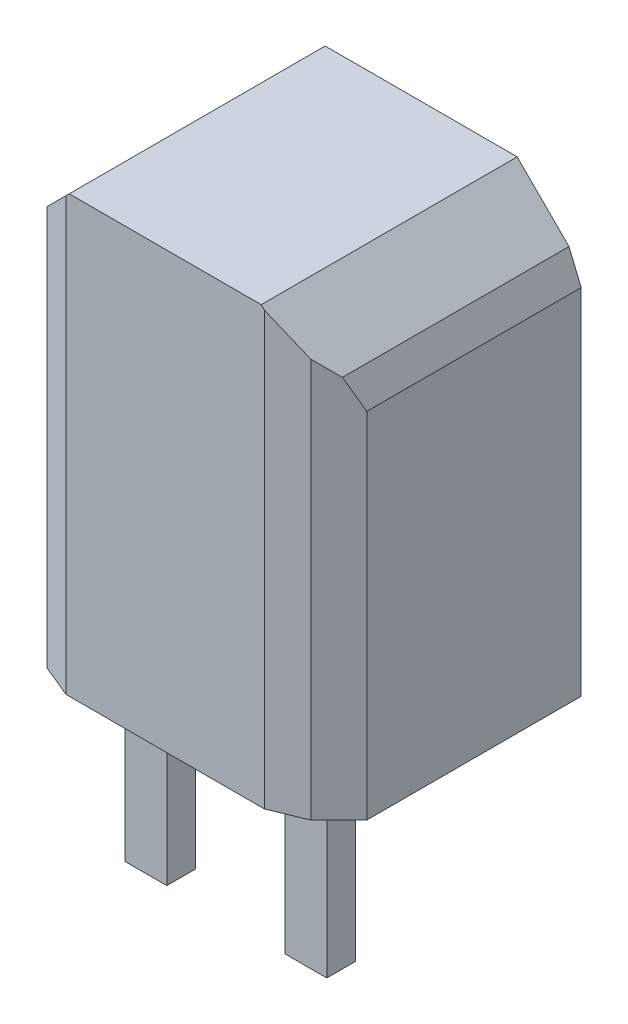
ISO-10303-21;
HEADER;
FILE_DESCRIPTION(('STEP AP214'),'2;1');
FILE_NAME('part.step','',(''),(''),'','','');
FILE_SCHEMA(('AUTOMOTIVE_DESIGN { 1 0 10303 214 1 1 1 1 }'));
ENDSEC;
DATA;
#1=APPLICATION_CONTEXT('core data for automotive mechanical design processes');
#2=APPLICATION_PROTOCOL_DEFINITION('international standard','automotive_design',2000,#1);
#3=PRODUCT_CONTEXT('',#1,'mechanical');
#4=PRODUCT('Part','Part','',(#3));
#5=PRODUCT_RELATED_PRODUCT_CATEGORY('part','',(#4));
#6=PRODUCT_DEFINITION_FORMATION('','',#4);
#7=PRODUCT_DEFINITION_CONTEXT('part definition',#1,'design');
#8=PRODUCT_DEFINITION('design','',#6,#7);
#9=PRODUCT_DEFINITION_SHAPE('','',#8);
#10=(LENGTH_UNIT() NAMED_UNIT(*) SI_UNIT(.MILLI.,.METRE.));
#11=(NAMED_UNIT(*) PLANE_ANGLE_UNIT() SI_UNIT($,.RADIAN.));
#12=(NAMED_UNIT(*) SI_UNIT($,.STERADIAN.) SOLID_ANGLE_UNIT());
#13=UNCERTAINTY_MEASURE_WITH_UNIT(LENGTH_MEASURE(1.E-05),#10,'distance_accuracy_value','');
#14=(GEOMETRIC_REPRESENTATION_CONTEXT(3) GLOBAL_UNCERTAINTY_ASSIGNED_CONTEXT((#13)) GLOBAL_UNIT_ASSIGNED_CONTEXT((#10,
#11,#12)) REPRESENTATION_CONTEXT('',''));
#15=CARTESIAN_POINT('',(0.,0.,0.));
#16=DIRECTION('',(0.,0.,1.));
#17=DIRECTION('',(1.,0.,0.));
#18=AXIS2_PLACEMENT_3D('',#15,#16,#17);
#19=CARTESIAN_POINT('',(0.,0.,4.));
#20=DIRECTION('',(0.,1.,0.));
#21=DIRECTION('',(0.,0.,1.));
#22=AXIS2_PLACEMENT_3D('',#19,#20,#21);
#23=PLANE('',#22);
#24=DIRECTION('',(0.,0.,1.));
#25=VECTOR('',#24,1.);
#26=CARTESIAN_POINT('',(1.575,0.,3.05));
#27=LINE('',#26,#25);
#28=CARTESIAN_POINT('',(1.575,0.,2.6));
#29=VERTEX_POINT('',#28);
#30=CARTESIAN_POINT('',(1.575,0.,3.05));
#31=VERTEX_POINT('',#30);
#32=EDGE_CURVE('E209',#29,#31,#27,.T.);
#33=ORIENTED_EDGE('',*,*,#32,.F.);
#34=DIRECTION('',(1.,0.,0.));
#35=VECTOR('',#34,1.);
#36=CARTESIAN_POINT('',(0.925,0.,2.6));
#37=LINE('',#36,#35);
#38=CARTESIAN_POINT('',(0.925,0.,2.6));
#39=VERTEX_POINT('',#38);
#40=EDGE_CURVE('E225',#39,#29,#37,.T.);
#41=ORIENTED_EDGE('',*,*,#40,.F.);
#42=DIRECTION('',(0.,0.,-1.));
#43=VECTOR('',#42,1.);
#44=CARTESIAN_POINT('',(0.925,0.,3.05));
#45=LINE('',#44,#43);
#46=CARTESIAN_POINT('',(0.925,0.,3.05));
#47=VERTEX_POINT('',#46);
#48=EDGE_CURVE('E238',#47,#39,#45,.T.);
#49=ORIENTED_EDGE('',*,*,#48,.F.);
#50=DIRECTION('',(-1.,0.,0.));
#51=VECTOR('',#50,1.);
#52=CARTESIAN_POINT('',(0.925,0.,3.05));
#53=LINE('',#52,#51);
#54=EDGE_CURVE('E214',#31,#47,#53,.T.);
#55=ORIENTED_EDGE('',*,*,#54,.F.);
#56=EDGE_LOOP('',(#33,#41,#49,#55));
#57=FACE_BOUND('',#56,.T.);
#58=DIRECTION('',(0.707106781186546,0.,-0.707106781186549));
#59=VECTOR('',#58,1.);
#60=CARTESIAN_POINT('',(4.35,0.,4.));
#61=LINE('',#60,#59);
#62=CARTESIAN_POINT('',(5.,0.,3.35));
#63=VERTEX_POINT('',#62);
#64=CARTESIAN_POINT('',(4.56213203435597,0.,3.78786796564403));
#65=VERTEX_POINT('',#64);
#66=EDGE_CURVE('E319',#63,#65,#61,.F.);
#67=ORIENTED_EDGE('',*,*,#66,.T.);
#68=DIRECTION('',(0.923879532511287,0.,-0.382683432365091));
#69=VECTOR('',#68,1.);
#70=CARTESIAN_POINT('',(4.05,0.,4.));
#71=LINE('',#70,#69);
#72=CARTESIAN_POINT('',(4.05,0.,4.));
#73=VERTEX_POINT('',#72);
#74=EDGE_CURVE('E13',#65,#73,#71,.F.);
#75=ORIENTED_EDGE('',*,*,#74,.T.);
#76=DIRECTION('',(1.,0.,0.));
#77=VECTOR('',#76,1.);
#78=CARTESIAN_POINT('',(0.,0.,4.));
#79=LINE('',#78,#77);
#80=CARTESIAN_POINT('',(0.950000000000004,0.,4.));
#81=VERTEX_POINT('',#80);
#82=EDGE_CURVE('E261',#81,#73,#79,.T.);
#83=ORIENTED_EDGE('',*,*,#82,.F.);
#84=DIRECTION('',(0.923879532511287,0.,0.38268343236509));
#85=VECTOR('',#84,1.);
#86=CARTESIAN_POINT('',(0.950000000000004,0.,4.));
#87=LINE('',#86,#85);
#88=CARTESIAN_POINT('',(0.437867965644034,0.,3.78786796564403));
#89=VERTEX_POINT('',#88);
#90=EDGE_CURVE('E362',#81,#89,#87,.F.);
#91=ORIENTED_EDGE('',*,*,#90,.T.);
#92=DIRECTION('',(0.707106781186546,0.,0.707106781186549));
#93=VECTOR('',#92,1.);
#94=CARTESIAN_POINT('',(0.65,0.,4.));
#95=LINE('',#94,#93);
#96=CARTESIAN_POINT('',(0.,0.,3.35));
#97=VERTEX_POINT('',#96);
#98=EDGE_CURVE('E316',#89,#97,#95,.F.);
#99=ORIENTED_EDGE('',*,*,#98,.T.);
#100=DIRECTION('',(0.,0.,-1.));
#101=VECTOR('',#100,1.);
#102=CARTESIAN_POINT('',(0.,0.,4.));
#103=LINE('',#102,#101);
#104=CARTESIAN_POINT('',(0.,0.,0.));
#105=VERTEX_POINT('',#104);
#106=EDGE_CURVE('E306',#97,#105,#103,.T.);
#107=ORIENTED_EDGE('',*,*,#106,.T.);
#108=DIRECTION('',(1.,0.,0.));
#109=VECTOR('',#108,1.);
#110=CARTESIAN_POINT('',(0.,0.,0.));
#111=LINE('',#110,#109);
#112=CARTESIAN_POINT('',(5.,0.,0.));
#113=VERTEX_POINT('',#112);
#114=EDGE_CURVE('E279',#105,#113,#111,.T.);
#115=ORIENTED_EDGE('',*,*,#114,.T.);
#116=DIRECTION('',(0.,0.,-1.));
#117=VECTOR('',#116,1.);
#118=CARTESIAN_POINT('',(5.,0.,4.));
#119=LINE('',#118,#117);
#120=EDGE_CURVE('E303',#63,#113,#119,.T.);
#121=ORIENTED_EDGE('',*,*,#120,.F.);
#122=EDGE_LOOP('',(#67,#75,#83,#91,#99,#107,#115,#121));
#123=FACE_BOUND('',#122,.T.);
#124=DIRECTION('',(-1.,0.,0.));
#125=VECTOR('',#124,1.);
#126=CARTESIAN_POINT('',(4.075,0.,3.05));
#127=LINE('',#126,#125);
#128=CARTESIAN_POINT('',(4.075,0.,3.05));
#129=VERTEX_POINT('',#128);
#130=CARTESIAN_POINT('',(3.425,0.,3.05));
#131=VERTEX_POINT('',#130);
#132=EDGE_CURVE('E207',#129,#131,#127,.T.);
#133=ORIENTED_EDGE('',*,*,#132,.F.);
#134=DIRECTION('',(0.,0.,1.));
#135=VECTOR('',#134,1.);
#136=CARTESIAN_POINT('',(4.075,0.,3.05));
#137=LINE('',#136,#135);
#138=CARTESIAN_POINT('',(4.075,0.,2.6));
#139=VERTEX_POINT('',#138);
#140=EDGE_CURVE('E204',#139,#129,#137,.T.);
#141=ORIENTED_EDGE('',*,*,#140,.F.);
#142=DIRECTION('',(1.,0.,0.));
#143=VECTOR('',#142,1.);
#144=CARTESIAN_POINT('',(4.075,0.,2.6));
#145=LINE('',#144,#143);
#146=CARTESIAN_POINT('',(3.425,0.,2.6));
#147=VERTEX_POINT('',#146);
#148=EDGE_CURVE('E69',#147,#139,#145,.T.);
#149=ORIENTED_EDGE('',*,*,#148,.F.);
#150=DIRECTION('',(0.,0.,-1.));
#151=VECTOR('',#150,1.);
#152=CARTESIAN_POINT('',(3.425,0.,3.05));
#153=LINE('',#152,#151);
#154=EDGE_CURVE('E64',#131,#147,#153,.T.);
#155=ORIENTED_EDGE('',*,*,#154,.F.);
#156=EDGE_LOOP('',(#133,#141,#149,#155));
#157=FACE_BOUND('',#156,.T.);
#158=ADVANCED_FACE('F47',(#57,#123,#157),#23,.F.);
#159=CARTESIAN_POINT('',(0.,0.,4.));
#160=DIRECTION('',(1.,0.,0.));
#161=DIRECTION('',(0.,0.,-1.));
#162=AXIS2_PLACEMENT_3D('',#159,#160,#161);
#163=PLANE('',#162);
#164=DIRECTION('',(0.,1.,0.));
#165=VECTOR('',#164,1.);
#166=CARTESIAN_POINT('',(0.,0.,3.35));
#167=LINE('',#166,#165);
#168=CARTESIAN_POINT('',(0.,5.53076118445749,3.35));
#169=VERTEX_POINT('',#168);
#170=EDGE_CURVE('E323',#97,#169,#167,.T.);
#171=ORIENTED_EDGE('',*,*,#170,.T.);
#172=DIRECTION('',(0.,0.,-1.));
#173=VECTOR('',#172,1.);
#174=CARTESIAN_POINT('',(0.,5.53076118445749,4.));
#175=LINE('',#174,#173);
#176=CARTESIAN_POINT('',(0.,5.53076118445749,0.));
#177=VERTEX_POINT('',#176);
#178=EDGE_CURVE('E331',#169,#177,#175,.T.);
#179=ORIENTED_EDGE('',*,*,#178,.T.);
#180=DIRECTION('',(0.,-1.,0.));
#181=VECTOR('',#180,1.);
#182=CARTESIAN_POINT('',(0.,0.,0.));
#183=LINE('',#182,#181);
#184=EDGE_CURVE('E260',#177,#105,#183,.T.);
#185=ORIENTED_EDGE('',*,*,#184,.T.);
#186=ORIENTED_EDGE('',*,*,#106,.F.);
#187=EDGE_LOOP('',(#171,#179,#185,#186));
#188=FACE_BOUND('',#187,.T.);
#189=ADVANCED_FACE('F418',(#188),#163,.F.);
#190=CARTESIAN_POINT('',(5.,5.8,4.));
#191=DIRECTION('',(-1.,0.,0.));
#192=DIRECTION('',(0.,0.,1.));
#193=AXIS2_PLACEMENT_3D('',#190,#191,#192);
#194=PLANE('',#193);
#195=DIRECTION('',(0.,1.,0.));
#196=VECTOR('',#195,1.);
#197=CARTESIAN_POINT('',(5.,5.8,0.));
#198=LINE('',#197,#196);
#199=CARTESIAN_POINT('',(5.,5.53076118445749,0.));
#200=VERTEX_POINT('',#199);
#201=EDGE_CURVE('E283',#113,#200,#198,.T.);
#202=ORIENTED_EDGE('',*,*,#201,.T.);
#203=DIRECTION('',(0.,0.,1.));
#204=VECTOR('',#203,1.);
#205=CARTESIAN_POINT('',(5.,5.53076118445749,4.));
#206=LINE('',#205,#204);
#207=CARTESIAN_POINT('',(5.,5.53076118445749,3.35));
#208=VERTEX_POINT('',#207);
#209=EDGE_CURVE('E351',#200,#208,#206,.T.);
#210=ORIENTED_EDGE('',*,*,#209,.T.);
#211=DIRECTION('',(0.,-1.,0.));
#212=VECTOR('',#211,1.);
#213=CARTESIAN_POINT('',(5.,5.8,3.35));
#214=LINE('',#213,#212);
#215=EDGE_CURVE('E313',#208,#63,#214,.T.);
#216=ORIENTED_EDGE('',*,*,#215,.T.);
#217=ORIENTED_EDGE('',*,*,#120,.T.);
#218=EDGE_LOOP('',(#202,#210,#216,#217));
#219=FACE_BOUND('',#218,.T.);
#220=ADVANCED_FACE('F443',(#219),#194,.F.);
#221=CARTESIAN_POINT('',(4.,6.8,4.));
#222=DIRECTION('',(-0.707106781186547,-0.707106781186547,0.));
#223=DIRECTION('',(0.707106781186548,-0.707106781186548,0.));
#224=AXIS2_PLACEMENT_3D('',#221,#222,#223);
#225=PLANE('',#224);
#226=DIRECTION('',(-0.707106781186548,0.707106781186548,0.));
#227=VECTOR('',#226,1.);
#228=CARTESIAN_POINT('',(4.,6.8,4.));
#229=LINE('',#228,#227);
#230=CARTESIAN_POINT('',(4.05,6.75,4.));
#231=VERTEX_POINT('',#230);
#232=CARTESIAN_POINT('',(4.,6.8,4.));
#233=VERTEX_POINT('',#232);
#234=EDGE_CURVE('E265',#231,#233,#229,.T.);
#235=ORIENTED_EDGE('',*,*,#234,.F.);
#236=DIRECTION('',(-0.678598344545847,0.678598344545847,0.281084637714821));
#237=VECTOR('',#236,1.);
#238=CARTESIAN_POINT('',(7.15834606423746,3.64165393576254,2.71248090364381));
#239=LINE('',#238,#237);
#240=CARTESIAN_POINT('',(4.56213203435597,6.23786796564403,3.78786796564403));
#241=VERTEX_POINT('',#240);
#242=EDGE_CURVE('E375',#231,#241,#239,.F.);
#243=ORIENTED_EDGE('',*,*,#242,.T.);
#244=DIRECTION('',(-0.577350269189625,0.577350269189625,0.577350269189627));
#245=VECTOR('',#244,1.);
#246=CARTESIAN_POINT('',(6.5,4.3,1.85));
#247=LINE('',#246,#245);
#248=CARTESIAN_POINT('',(4.80961940777126,5.99038059222874,3.54038059222875));
#249=VERTEX_POINT('',#248);
#250=EDGE_CURVE('E310',#241,#249,#247,.F.);
#251=ORIENTED_EDGE('',*,*,#250,.T.);
#252=DIRECTION('',(0.,0.,-1.));
#253=VECTOR('',#252,1.);
#254=CARTESIAN_POINT('',(4.80961940777126,5.99038059222874,4.));
#255=LINE('',#254,#253);
#256=CARTESIAN_POINT('',(4.80961940777126,5.99038059222874,0.));
#257=VERTEX_POINT('',#256);
#258=EDGE_CURVE('E344',#249,#257,#255,.T.);
#259=ORIENTED_EDGE('',*,*,#258,.T.);
#260=DIRECTION('',(-0.707106781186548,0.707106781186548,0.));
#261=VECTOR('',#260,1.);
#262=CARTESIAN_POINT('',(4.,6.8,0.));
#263=LINE('',#262,#261);
#264=CARTESIAN_POINT('',(4.,6.8,0.));
#265=VERTEX_POINT('',#264);
#266=EDGE_CURVE('E287',#257,#265,#263,.T.);
#267=ORIENTED_EDGE('',*,*,#266,.T.);
#268=DIRECTION('',(0.,0.,-1.));
#269=VECTOR('',#268,1.);
#270=CARTESIAN_POINT('',(4.,6.8,4.));
#271=LINE('',#270,#269);
#272=EDGE_CURVE('E299',#233,#265,#271,.T.);
#273=ORIENTED_EDGE('',*,*,#272,.F.);
#274=EDGE_LOOP('',(#235,#243,#251,#259,#267,#273));
#275=FACE_BOUND('',#274,.T.);
#276=ADVANCED_FACE('F395',(#275),#225,.F.);
#277=CARTESIAN_POINT('',(1.,6.8,4.));
#278=DIRECTION('',(0.,-1.,0.));
#279=DIRECTION('',(0.,0.,-1.));
#280=AXIS2_PLACEMENT_3D('',#277,#278,#279);
#281=PLANE('',#280);
#282=DIRECTION('',(-1.,0.,0.));
#283=VECTOR('',#282,1.);
#284=CARTESIAN_POINT('',(1.,6.8,0.));
#285=LINE('',#284,#283);
#286=CARTESIAN_POINT('',(1.,6.8,0.));
#287=VERTEX_POINT('',#286);
#288=EDGE_CURVE('E290',#265,#287,#285,.T.);
#289=ORIENTED_EDGE('',*,*,#288,.T.);
#290=DIRECTION('',(0.,0.,-1.));
#291=VECTOR('',#290,1.);
#292=CARTESIAN_POINT('',(1.,6.8,4.));
#293=LINE('',#292,#291);
#294=CARTESIAN_POINT('',(1.,6.8,4.));
#295=VERTEX_POINT('',#294);
#296=EDGE_CURVE('E276',#295,#287,#293,.T.);
#297=ORIENTED_EDGE('',*,*,#296,.F.);
#298=DIRECTION('',(-1.,0.,0.));
#299=VECTOR('',#298,1.);
#300=CARTESIAN_POINT('',(1.,6.8,4.));
#301=LINE('',#300,#299);
#302=EDGE_CURVE('E269',#233,#295,#301,.T.);
#303=ORIENTED_EDGE('',*,*,#302,.F.);
#304=ORIENTED_EDGE('',*,*,#272,.T.);
#305=EDGE_LOOP('',(#289,#297,#303,#304));
#306=FACE_BOUND('',#305,.T.);
#307=ADVANCED_FACE('F401',(#306),#281,.F.);
#308=CARTESIAN_POINT('',(0.,5.8,4.));
#309=DIRECTION('',(0.707106781186547,-0.707106781186547,0.));
#310=DIRECTION('',(0.707106781186548,0.707106781186548,0.));
#311=AXIS2_PLACEMENT_3D('',#308,#309,#310);
#312=PLANE('',#311);
#313=DIRECTION('',(-0.577350269189625,-0.577350269189625,-0.577350269189627));
#314=VECTOR('',#313,1.);
#315=CARTESIAN_POINT('',(-1.49999999999999,4.3,1.85));
#316=LINE('',#315,#314);
#317=CARTESIAN_POINT('',(0.190380592228745,5.99038059222874,3.54038059222874));
#318=VERTEX_POINT('',#317);
#319=CARTESIAN_POINT('',(0.437867965644034,6.23786796564403,3.78786796564403));
#320=VERTEX_POINT('',#319);
#321=EDGE_CURVE('E327',#318,#320,#316,.F.);
#322=ORIENTED_EDGE('',*,*,#321,.T.);
#323=DIRECTION('',(-0.678598344545847,-0.678598344545847,-0.281084637714821));
#324=VECTOR('',#323,1.);
#325=CARTESIAN_POINT('',(-2.15834606423745,3.64165393576254,2.71248090364381));
#326=LINE('',#325,#324);
#327=CARTESIAN_POINT('',(0.950000000000004,6.75,4.));
#328=VERTEX_POINT('',#327);
#329=EDGE_CURVE('E368',#320,#328,#326,.F.);
#330=ORIENTED_EDGE('',*,*,#329,.T.);
#331=DIRECTION('',(-0.707106781186548,-0.707106781186548,0.));
#332=VECTOR('',#331,1.);
#333=CARTESIAN_POINT('',(0.,5.8,4.));
#334=LINE('',#333,#332);
#335=EDGE_CURVE('E272',#295,#328,#334,.T.);
#336=ORIENTED_EDGE('',*,*,#335,.F.);
#337=ORIENTED_EDGE('',*,*,#296,.T.);
#338=DIRECTION('',(-0.707106781186548,-0.707106781186548,0.));
#339=VECTOR('',#338,1.);
#340=CARTESIAN_POINT('',(0.,5.8,0.));
#341=LINE('',#340,#339);
#342=CARTESIAN_POINT('',(0.190380592228745,5.99038059222874,0.));
#343=VERTEX_POINT('',#342);
#344=EDGE_CURVE('E266',#287,#343,#341,.T.);
#345=ORIENTED_EDGE('',*,*,#344,.T.);
#346=DIRECTION('',(0.,0.,1.));
#347=VECTOR('',#346,1.);
#348=CARTESIAN_POINT('',(0.190380592228745,5.99038059222874,4.));
#349=LINE('',#348,#347);
#350=EDGE_CURVE('E338',#343,#318,#349,.T.);
#351=ORIENTED_EDGE('',*,*,#350,.T.);
#352=EDGE_LOOP('',(#322,#330,#336,#337,#345,#351));
#353=FACE_BOUND('',#352,.T.);
#354=ADVANCED_FACE('F427',(#353),#312,.F.);
#355=CARTESIAN_POINT('',(0.,0.,4.));
#356=DIRECTION('',(0.,0.,-1.));
#357=DIRECTION('',(-1.,0.,0.));
#358=AXIS2_PLACEMENT_3D('',#355,#356,#357);
#359=PLANE('',#358);
#360=ORIENTED_EDGE('',*,*,#82,.T.);
#361=DIRECTION('',(0.,1.,0.));
#362=VECTOR('',#361,1.);
#363=CARTESIAN_POINT('',(4.05,6.45,4.));
#364=LINE('',#363,#362);
#365=EDGE_CURVE('E371',#73,#231,#364,.T.);
#366=ORIENTED_EDGE('',*,*,#365,.T.);
#367=ORIENTED_EDGE('',*,*,#234,.T.);
#368=ORIENTED_EDGE('',*,*,#302,.T.);
#369=ORIENTED_EDGE('',*,*,#335,.T.);
#370=DIRECTION('',(0.,-1.,0.));
#371=VECTOR('',#370,1.);
#372=CARTESIAN_POINT('',(0.950000000000004,0.,4.));
#373=LINE('',#372,#371);
#374=EDGE_CURVE('E358',#328,#81,#373,.T.);
#375=ORIENTED_EDGE('',*,*,#374,.T.);
#376=EDGE_LOOP('',(#360,#366,#367,#368,#369,#375));
#377=FACE_BOUND('',#376,.T.);
#378=ADVANCED_FACE('F392',(#377),#359,.F.);
#379=CARTESIAN_POINT('',(0.,0.,0.));
#380=DIRECTION('',(0.,0.,-1.));
#381=DIRECTION('',(-1.,0.,0.));
#382=AXIS2_PLACEMENT_3D('',#379,#380,#381);
#383=PLANE('',#382);
#384=ORIENTED_EDGE('',*,*,#266,.F.);
#385=DIRECTION('',(-0.38268343236509,0.923879532511287,0.));
#386=VECTOR('',#385,1.);
#387=CARTESIAN_POINT('',(6.22318632229299,2.5777281758685,0.));
#388=LINE('',#387,#386);
#389=EDGE_CURVE('E348',#257,#200,#388,.F.);
#390=ORIENTED_EDGE('',*,*,#389,.T.);
#391=ORIENTED_EDGE('',*,*,#201,.F.);
#392=ORIENTED_EDGE('',*,*,#114,.F.);
#393=ORIENTED_EDGE('',*,*,#184,.F.);
#394=DIRECTION('',(-0.382683432365091,-0.923879532511286,0.));
#395=VECTOR('',#394,1.);
#396=CARTESIAN_POINT('',(-1.95541936932662,0.809961222902132,0.));
#397=LINE('',#396,#395);
#398=EDGE_CURVE('E335',#177,#343,#397,.F.);
#399=ORIENTED_EDGE('',*,*,#398,.T.);
#400=ORIENTED_EDGE('',*,*,#344,.F.);
#401=ORIENTED_EDGE('',*,*,#288,.F.);
#402=EDGE_LOOP('',(#384,#390,#391,#392,#393,#399,#400,#401));
#403=FACE_BOUND('',#402,.T.);
#404=ADVANCED_FACE('F425',(#403),#383,.T.);
#405=CARTESIAN_POINT('',(4.35,0.,4.));
#406=DIRECTION('',(-0.707106781186549,0.,-0.707106781186546));
#407=DIRECTION('',(0.,1.,0.));
#408=AXIS2_PLACEMENT_3D('',#405,#406,#407);
#409=PLANE('',#408);
#410=ORIENTED_EDGE('',*,*,#250,.F.);
#411=DIRECTION('',(0.,1.,0.));
#412=VECTOR('',#411,1.);
#413=CARTESIAN_POINT('',(4.56213203435597,0.,3.78786796564403));
#414=LINE('',#413,#412);
#415=EDGE_CURVE('E57',#241,#65,#414,.F.);
#416=ORIENTED_EDGE('',*,*,#415,.T.);
#417=ORIENTED_EDGE('',*,*,#66,.F.);
#418=ORIENTED_EDGE('',*,*,#215,.F.);
#419=DIRECTION('',(-0.357406744336594,0.862856209461016,0.357406744336595));
#420=VECTOR('',#419,1.);
#421=CARTESIAN_POINT('',(6.53957346344394,1.81390204874142,1.81042653655606));
#422=LINE('',#421,#420);
#423=EDGE_CURVE('E354',#208,#249,#422,.T.);
#424=ORIENTED_EDGE('',*,*,#423,.T.);
#425=EDGE_LOOP('',(#410,#416,#417,#418,#424));
#426=FACE_BOUND('',#425,.T.);
#427=ADVANCED_FACE('F382',(#426),#409,.F.);
#428=CARTESIAN_POINT('',(0.65,0.,4.));
#429=DIRECTION('',(0.707106781186549,0.,-0.707106781186546));
#430=DIRECTION('',(0.,-1.,0.));
#431=AXIS2_PLACEMENT_3D('',#428,#429,#430);
#432=PLANE('',#431);
#433=ORIENTED_EDGE('',*,*,#98,.F.);
#434=DIRECTION('',(0.,-1.,0.));
#435=VECTOR('',#434,1.);
#436=CARTESIAN_POINT('',(0.437867965644034,6.45,3.78786796564403));
#437=LINE('',#436,#435);
#438=EDGE_CURVE('E365',#89,#320,#437,.F.);
#439=ORIENTED_EDGE('',*,*,#438,.T.);
#440=ORIENTED_EDGE('',*,*,#321,.F.);
#441=DIRECTION('',(-0.357406744336594,-0.862856209461016,-0.357406744336595));
#442=VECTOR('',#441,1.);
#443=CARTESIAN_POINT('',(-1.53957346344394,1.81390204874143,1.81042653655606));
#444=LINE('',#443,#442);
#445=EDGE_CURVE('E341',#318,#169,#444,.T.);
#446=ORIENTED_EDGE('',*,*,#445,.T.);
#447=ORIENTED_EDGE('',*,*,#170,.F.);
#448=EDGE_LOOP('',(#433,#439,#440,#446,#447));
#449=FACE_BOUND('',#448,.T.);
#450=ADVANCED_FACE('F413',(#449),#432,.F.);
#451=CARTESIAN_POINT('',(0.,5.53076118445749,4.));
#452=DIRECTION('',(0.923879532511286,-0.382683432365091,0.));
#453=DIRECTION('',(0.,0.,-1.));
#454=AXIS2_PLACEMENT_3D('',#451,#452,#453);
#455=PLANE('',#454);
#456=ORIENTED_EDGE('',*,*,#445,.F.);
#457=ORIENTED_EDGE('',*,*,#350,.F.);
#458=ORIENTED_EDGE('',*,*,#398,.F.);
#459=ORIENTED_EDGE('',*,*,#178,.F.);
#460=EDGE_LOOP('',(#456,#457,#458,#459));
#461=FACE_BOUND('',#460,.T.);
#462=ADVANCED_FACE('F421',(#461),#455,.F.);
#463=CARTESIAN_POINT('',(4.80961940777126,5.99038059222874,4.));
#464=DIRECTION('',(-0.923879532511287,-0.38268343236509,0.));
#465=DIRECTION('',(0.,0.,-1.));
#466=AXIS2_PLACEMENT_3D('',#463,#464,#465);
#467=PLANE('',#466);
#468=ORIENTED_EDGE('',*,*,#423,.F.);
#469=ORIENTED_EDGE('',*,*,#209,.F.);
#470=ORIENTED_EDGE('',*,*,#389,.F.);
#471=ORIENTED_EDGE('',*,*,#258,.F.);
#472=EDGE_LOOP('',(#468,#469,#470,#471));
#473=FACE_BOUND('',#472,.T.);
#474=ADVANCED_FACE('F464',(#473),#467,.F.);
#475=CARTESIAN_POINT('',(0.950000000000004,0.,4.));
#476=DIRECTION('',(0.38268343236509,0.,-0.923879532511287));
#477=DIRECTION('',(0.,-1.,0.));
#478=AXIS2_PLACEMENT_3D('',#475,#476,#477);
#479=PLANE('',#478);
#480=ORIENTED_EDGE('',*,*,#329,.F.);
#481=ORIENTED_EDGE('',*,*,#438,.F.);
#482=ORIENTED_EDGE('',*,*,#90,.F.);
#483=ORIENTED_EDGE('',*,*,#374,.F.);
#484=EDGE_LOOP('',(#480,#481,#482,#483));
#485=FACE_BOUND('',#484,.T.);
#486=ADVANCED_FACE('F407',(#485),#479,.F.);
#487=CARTESIAN_POINT('',(4.05,0.,4.));
#488=DIRECTION('',(-0.382683432365091,0.,-0.923879532511286));
#489=DIRECTION('',(0.,1.,0.));
#490=AXIS2_PLACEMENT_3D('',#487,#488,#489);
#491=PLANE('',#490);
#492=ORIENTED_EDGE('',*,*,#74,.F.);
#493=ORIENTED_EDGE('',*,*,#415,.F.);
#494=ORIENTED_EDGE('',*,*,#242,.F.);
#495=ORIENTED_EDGE('',*,*,#365,.F.);
#496=EDGE_LOOP('',(#492,#493,#494,#495));
#497=FACE_BOUND('',#496,.T.);
#498=ADVANCED_FACE('F50',(#497),#491,.F.);
#499=CARTESIAN_POINT('',(1.575,-2.75,3.05));
#500=DIRECTION('',(-1.,0.,0.));
#501=DIRECTION('',(0.,0.,1.));
#502=AXIS2_PLACEMENT_3D('',#499,#500,#501);
#503=PLANE('',#502);
#504=ORIENTED_EDGE('',*,*,#32,.T.);
#505=DIRECTION('',(0.,1.,0.));
#506=VECTOR('',#505,1.);
#507=CARTESIAN_POINT('',(1.575,-2.75,3.05));
#508=LINE('',#507,#506);
#509=CARTESIAN_POINT('',(1.575,-2.75,3.05));
#510=VERTEX_POINT('',#509);
#511=EDGE_CURVE('E256',#510,#31,#508,.T.);
#512=ORIENTED_EDGE('',*,*,#511,.F.);
#513=DIRECTION('',(0.,0.,1.));
#514=VECTOR('',#513,1.);
#515=CARTESIAN_POINT('',(1.575,-2.75,3.05));
#516=LINE('',#515,#514);
#517=CARTESIAN_POINT('',(1.575,-2.75,2.6));
#518=VERTEX_POINT('',#517);
#519=EDGE_CURVE('E220',#518,#510,#516,.T.);
#520=ORIENTED_EDGE('',*,*,#519,.F.);
#521=DIRECTION('',(0.,1.,0.));
#522=VECTOR('',#521,1.);
#523=CARTESIAN_POINT('',(1.575,-2.75,2.6));
#524=LINE('',#523,#522);
#525=EDGE_CURVE('E233',#518,#29,#524,.T.);
#526=ORIENTED_EDGE('',*,*,#525,.T.);
#527=EDGE_LOOP('',(#504,#512,#520,#526));
#528=FACE_BOUND('',#527,.T.);
#529=ADVANCED_FACE('F476',(#528),#503,.F.);
#530=CARTESIAN_POINT('',(0.925,-2.75,3.05));
#531=DIRECTION('',(0.,0.,-1.));
#532=DIRECTION('',(-1.,0.,0.));
#533=AXIS2_PLACEMENT_3D('',#530,#531,#532);
#534=PLANE('',#533);
#535=ORIENTED_EDGE('',*,*,#54,.T.);
#536=DIRECTION('',(0.,1.,0.));
#537=VECTOR('',#536,1.);
#538=CARTESIAN_POINT('',(0.925,-2.75,3.05));
#539=LINE('',#538,#537);
#540=CARTESIAN_POINT('',(0.925,-2.75,3.05));
#541=VERTEX_POINT('',#540);
#542=EDGE_CURVE('E252',#541,#47,#539,.T.);
#543=ORIENTED_EDGE('',*,*,#542,.F.);
#544=DIRECTION('',(-1.,0.,0.));
#545=VECTOR('',#544,1.);
#546=CARTESIAN_POINT('',(0.925,-2.75,3.05));
#547=LINE('',#546,#545);
#548=EDGE_CURVE('E224',#510,#541,#547,.T.);
#549=ORIENTED_EDGE('',*,*,#548,.F.);
#550=ORIENTED_EDGE('',*,*,#511,.T.);
#551=EDGE_LOOP('',(#535,#543,#549,#550));
#552=FACE_BOUND('',#551,.T.);
#553=ADVANCED_FACE('F480',(#552),#534,.F.);
#554=CARTESIAN_POINT('',(0.925,-2.75,3.05));
#555=DIRECTION('',(1.,0.,0.));
#556=DIRECTION('',(0.,0.,-1.));
#557=AXIS2_PLACEMENT_3D('',#554,#555,#556);
#558=PLANE('',#557);
#559=ORIENTED_EDGE('',*,*,#48,.T.);
#560=DIRECTION('',(0.,1.,0.));
#561=VECTOR('',#560,1.);
#562=CARTESIAN_POINT('',(0.925,-2.75,2.6));
#563=LINE('',#562,#561);
#564=CARTESIAN_POINT('',(0.925,-2.75,2.6));
#565=VERTEX_POINT('',#564);
#566=EDGE_CURVE('E248',#565,#39,#563,.T.);
#567=ORIENTED_EDGE('',*,*,#566,.F.);
#568=DIRECTION('',(0.,0.,-1.));
#569=VECTOR('',#568,1.);
#570=CARTESIAN_POINT('',(0.925,-2.75,3.05));
#571=LINE('',#570,#569);
#572=EDGE_CURVE('E228',#541,#565,#571,.T.);
#573=ORIENTED_EDGE('',*,*,#572,.F.);
#574=ORIENTED_EDGE('',*,*,#542,.T.);
#575=EDGE_LOOP('',(#559,#567,#573,#574));
#576=FACE_BOUND('',#575,.T.);
#577=ADVANCED_FACE('F486',(#576),#558,.F.);
#578=CARTESIAN_POINT('',(0.925,-2.75,2.6));
#579=DIRECTION('',(0.,0.,1.));
#580=DIRECTION('',(1.,0.,0.));
#581=AXIS2_PLACEMENT_3D('',#578,#579,#580);
#582=PLANE('',#581);
#583=ORIENTED_EDGE('',*,*,#40,.T.);
#584=ORIENTED_EDGE('',*,*,#525,.F.);
#585=DIRECTION('',(1.,0.,0.));
#586=VECTOR('',#585,1.);
#587=CARTESIAN_POINT('',(0.925,-2.75,2.6));
#588=LINE('',#587,#586);
#589=EDGE_CURVE('E231',#565,#518,#588,.T.);
#590=ORIENTED_EDGE('',*,*,#589,.F.);
#591=ORIENTED_EDGE('',*,*,#566,.T.);
#592=EDGE_LOOP('',(#583,#584,#590,#591));
#593=FACE_BOUND('',#592,.T.);
#594=ADVANCED_FACE('F573',(#593),#582,.F.);
#595=CARTESIAN_POINT('',(0.,-2.75,0.));
#596=DIRECTION('',(0.,-1.,0.));
#597=DIRECTION('',(0.,0.,-1.));
#598=AXIS2_PLACEMENT_3D('',#595,#596,#597);
#599=PLANE('',#598);
#600=ORIENTED_EDGE('',*,*,#519,.T.);
#601=ORIENTED_EDGE('',*,*,#548,.T.);
#602=ORIENTED_EDGE('',*,*,#572,.T.);
#603=ORIENTED_EDGE('',*,*,#589,.T.);
#604=EDGE_LOOP('',(#600,#601,#602,#603));
#605=FACE_BOUND('',#604,.T.);
#606=ADVANCED_FACE('F581',(#605),#599,.T.);
#607=CARTESIAN_POINT('',(4.075,-2.75,3.05));
#608=DIRECTION('',(0.,0.,-1.));
#609=DIRECTION('',(-1.,0.,0.));
#610=AXIS2_PLACEMENT_3D('',#607,#608,#609);
#611=PLANE('',#610);
#612=ORIENTED_EDGE('',*,*,#132,.T.);
#613=DIRECTION('',(0.,1.,0.));
#614=VECTOR('',#613,1.);
#615=CARTESIAN_POINT('',(3.425,-2.75,3.05));
#616=LINE('',#615,#614);
#617=CARTESIAN_POINT('',(3.425,-2.75,3.05));
#618=VERTEX_POINT('',#617);
#619=EDGE_CURVE('E186',#618,#131,#616,.T.);
#620=ORIENTED_EDGE('',*,*,#619,.F.);
#621=DIRECTION('',(-1.,0.,0.));
#622=VECTOR('',#621,1.);
#623=CARTESIAN_POINT('',(4.075,-2.75,3.05));
#624=LINE('',#623,#622);
#625=CARTESIAN_POINT('',(4.075,-2.75,3.05));
#626=VERTEX_POINT('',#625);
#627=EDGE_CURVE('E194',#626,#618,#624,.T.);
#628=ORIENTED_EDGE('',*,*,#627,.F.);
#629=DIRECTION('',(0.,1.,0.));
#630=VECTOR('',#629,1.);
#631=CARTESIAN_POINT('',(4.075,-2.75,3.05));
#632=LINE('',#631,#630);
#633=EDGE_CURVE('E642',#626,#129,#632,.T.);
#634=ORIENTED_EDGE('',*,*,#633,.T.);
#635=EDGE_LOOP('',(#612,#620,#628,#634));
#636=FACE_BOUND('',#635,.T.);
#637=ADVANCED_FACE('F206',(#636),#611,.F.);
#638=CARTESIAN_POINT('',(3.425,-2.75,3.05));
#639=DIRECTION('',(1.,0.,0.));
#640=DIRECTION('',(0.,0.,-1.));
#641=AXIS2_PLACEMENT_3D('',#638,#639,#640);
#642=PLANE('',#641);
#643=ORIENTED_EDGE('',*,*,#154,.T.);
#644=DIRECTION('',(0.,1.,0.));
#645=VECTOR('',#644,1.);
#646=CARTESIAN_POINT('',(3.425,-2.75,2.6));
#647=LINE('',#646,#645);
#648=CARTESIAN_POINT('',(3.425,-2.75,2.6));
#649=VERTEX_POINT('',#648);
#650=EDGE_CURVE('E189',#649,#147,#647,.T.);
#651=ORIENTED_EDGE('',*,*,#650,.F.);
#652=DIRECTION('',(0.,0.,-1.));
#653=VECTOR('',#652,1.);
#654=CARTESIAN_POINT('',(3.425,-2.75,3.05));
#655=LINE('',#654,#653);
#656=EDGE_CURVE('E182',#618,#649,#655,.T.);
#657=ORIENTED_EDGE('',*,*,#656,.F.);
#658=ORIENTED_EDGE('',*,*,#619,.T.);
#659=EDGE_LOOP('',(#643,#651,#657,#658));
#660=FACE_BOUND('',#659,.T.);
#661=ADVANCED_FACE('F184',(#660),#642,.F.);
#662=CARTESIAN_POINT('',(4.075,-2.75,2.6));
#663=DIRECTION('',(0.,0.,1.));
#664=DIRECTION('',(1.,0.,0.));
#665=AXIS2_PLACEMENT_3D('',#662,#663,#664);
#666=PLANE('',#665);
#667=ORIENTED_EDGE('',*,*,#148,.T.);
#668=DIRECTION('',(0.,1.,0.));
#669=VECTOR('',#668,1.);
#670=CARTESIAN_POINT('',(4.075,-2.75,2.6));
#671=LINE('',#670,#669);
#672=CARTESIAN_POINT('',(4.075,-2.75,2.6));
#673=VERTEX_POINT('',#672);
#674=EDGE_CURVE('E216',#673,#139,#671,.T.);
#675=ORIENTED_EDGE('',*,*,#674,.F.);
#676=DIRECTION('',(1.,0.,0.));
#677=VECTOR('',#676,1.);
#678=CARTESIAN_POINT('',(4.075,-2.75,2.6));
#679=LINE('',#678,#677);
#680=EDGE_CURVE('E193',#649,#673,#679,.T.);
#681=ORIENTED_EDGE('',*,*,#680,.F.);
#682=ORIENTED_EDGE('',*,*,#650,.T.);
#683=EDGE_LOOP('',(#667,#675,#681,#682));
#684=FACE_BOUND('',#683,.T.);
#685=ADVANCED_FACE('F605',(#684),#666,.F.);
#686=CARTESIAN_POINT('',(4.075,-2.75,3.05));
#687=DIRECTION('',(-1.,0.,0.));
#688=DIRECTION('',(0.,0.,1.));
#689=AXIS2_PLACEMENT_3D('',#686,#687,#688);
#690=PLANE('',#689);
#691=ORIENTED_EDGE('',*,*,#140,.T.);
#692=ORIENTED_EDGE('',*,*,#633,.F.);
#693=DIRECTION('',(0.,0.,1.));
#694=VECTOR('',#693,1.);
#695=CARTESIAN_POINT('',(4.075,-2.75,3.05));
#696=LINE('',#695,#694);
#697=EDGE_CURVE('E199',#673,#626,#696,.T.);
#698=ORIENTED_EDGE('',*,*,#697,.F.);
#699=ORIENTED_EDGE('',*,*,#674,.T.);
#700=EDGE_LOOP('',(#691,#692,#698,#699));
#701=FACE_BOUND('',#700,.T.);
#702=ADVANCED_FACE('F613',(#701),#690,.F.);
#703=CARTESIAN_POINT('',(0.,-2.75,0.));
#704=DIRECTION('',(0.,-1.,0.));
#705=DIRECTION('',(0.,0.,-1.));
#706=AXIS2_PLACEMENT_3D('',#703,#704,#705);
#707=PLANE('',#706);
#708=ORIENTED_EDGE('',*,*,#627,.T.);
#709=ORIENTED_EDGE('',*,*,#656,.T.);
#710=ORIENTED_EDGE('',*,*,#680,.T.);
#711=ORIENTED_EDGE('',*,*,#697,.T.);
#712=EDGE_LOOP('',(#708,#709,#710,#711));
#713=FACE_BOUND('',#712,.T.);
#714=ADVANCED_FACE('F197',(#713),#707,.T.);
#715=CLOSED_SHELL('',(#158,#189,#220,#276,#307,#354,#378,#404,#427,#450,#462,#474,#486,#498,
#529,#553,#577,#594,#606,#637,#661,#685,#702,#714));
#716=MANIFOLD_SOLID_BREP('B2',#715);
#717=ADVANCED_BREP_SHAPE_REPRESENTATION('',(#18,#716),#14);
#718=SHAPE_DEFINITION_REPRESENTATION(#9,#717);
ENDSEC;
END-ISO-10303-21;
